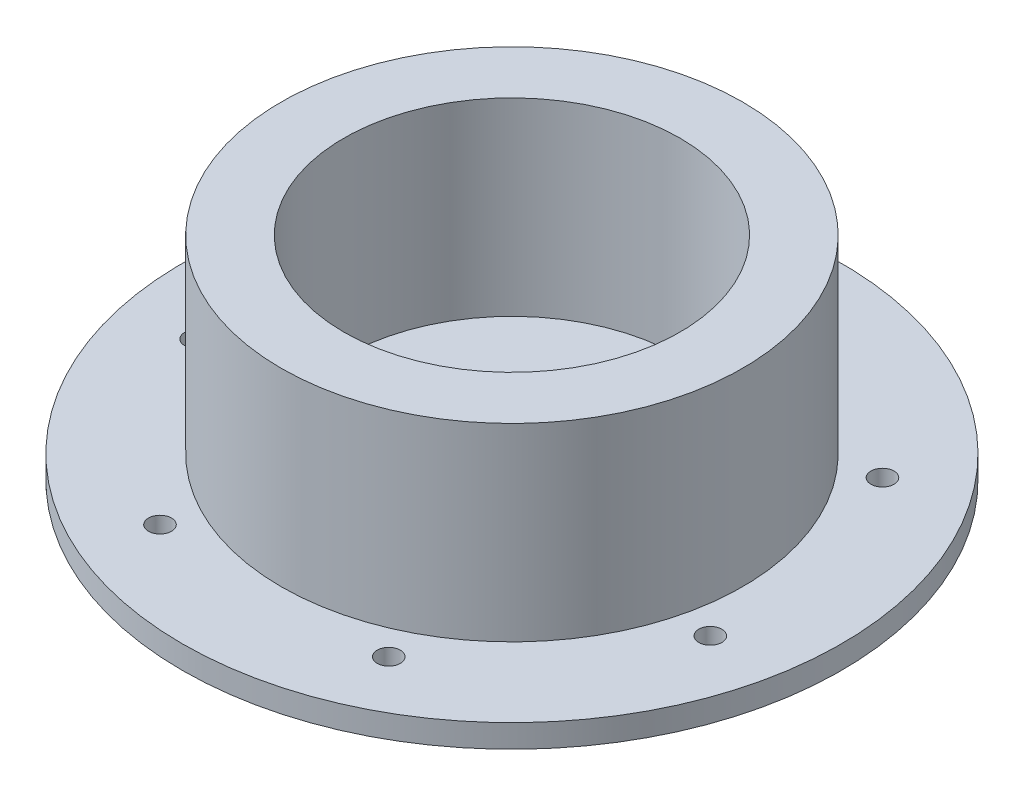
ISO-10303-21;
HEADER;
FILE_DESCRIPTION(('STEP AP214'),'2;1');
FILE_NAME('part.step','',(''),(''),'','','');
FILE_SCHEMA(('AUTOMOTIVE_DESIGN { 1 0 10303 214 1 1 1 1 }'));
ENDSEC;
DATA;
#1=APPLICATION_CONTEXT('core data for automotive mechanical design processes');
#2=APPLICATION_PROTOCOL_DEFINITION('international standard','automotive_design',2000,#1);
#3=PRODUCT_CONTEXT('',#1,'mechanical');
#4=PRODUCT('Part','Part','',(#3));
#5=PRODUCT_RELATED_PRODUCT_CATEGORY('part','',(#4));
#6=PRODUCT_DEFINITION_FORMATION('','',#4);
#7=PRODUCT_DEFINITION_CONTEXT('part definition',#1,'design');
#8=PRODUCT_DEFINITION('design','',#6,#7);
#9=PRODUCT_DEFINITION_SHAPE('','',#8);
#10=(LENGTH_UNIT() NAMED_UNIT(*) SI_UNIT(.MILLI.,.METRE.));
#11=(NAMED_UNIT(*) PLANE_ANGLE_UNIT() SI_UNIT($,.RADIAN.));
#12=(NAMED_UNIT(*) SI_UNIT($,.STERADIAN.) SOLID_ANGLE_UNIT());
#13=UNCERTAINTY_MEASURE_WITH_UNIT(LENGTH_MEASURE(1.E-05),#10,'distance_accuracy_value','');
#14=(GEOMETRIC_REPRESENTATION_CONTEXT(3) GLOBAL_UNCERTAINTY_ASSIGNED_CONTEXT((#13)) GLOBAL_UNIT_ASSIGNED_CONTEXT((#10,
#11,#12)) REPRESENTATION_CONTEXT('',''));
#15=CARTESIAN_POINT('',(0.,0.,0.));
#16=DIRECTION('',(0.,0.,1.));
#17=DIRECTION('',(1.,0.,0.));
#18=AXIS2_PLACEMENT_3D('',#15,#16,#17);
#19=CARTESIAN_POINT('',(0.,3.5,0.));
#20=DIRECTION('',(0.,1.,0.));
#21=DIRECTION('',(0.,0.,1.));
#22=AXIS2_PLACEMENT_3D('',#19,#20,#21);
#23=PLANE('',#22);
#24=CARTESIAN_POINT('',(0.,3.5,0.));
#25=DIRECTION('',(0.,1.,0.));
#26=DIRECTION('',(0.,0.,1.));
#27=AXIS2_PLACEMENT_3D('',#24,#25,#26);
#28=CIRCLE('',#27,35.);
#29=CARTESIAN_POINT('',(0.,3.5,35.));
#30=VERTEX_POINT('',#29);
#31=EDGE_CURVE('E95',#30,#30,#28,.T.);
#32=ORIENTED_EDGE('',*,*,#31,.F.);
#33=EDGE_LOOP('',(#32));
#34=FACE_BOUND('',#33,.T.);
#35=CARTESIAN_POINT('',(-38.997116487268,3.5,8.90083735825651));
#36=DIRECTION('',(0.,1.,0.));
#37=DIRECTION('',(0.,0.,1.));
#38=AXIS2_PLACEMENT_3D('',#35,#36,#37);
#39=CIRCLE('',#38,1.75);
#40=CARTESIAN_POINT('',(-38.997116487268,3.5,10.6508373582565));
#41=VERTEX_POINT('',#40);
#42=EDGE_CURVE('E80',#41,#41,#39,.T.);
#43=ORIENTED_EDGE('',*,*,#42,.F.);
#44=EDGE_LOOP('',(#43));
#45=FACE_BOUND('',#44,.T.);
#46=CARTESIAN_POINT('',(17.35534956471,3.5,36.038754716095));
#47=DIRECTION('',(0.,1.,0.));
#48=DIRECTION('',(0.,0.,1.));
#49=AXIS2_PLACEMENT_3D('',#46,#47,#48);
#50=CIRCLE('',#49,1.75);
#51=CARTESIAN_POINT('',(17.35534956471,3.5,37.788754716095));
#52=VERTEX_POINT('',#51);
#53=EDGE_CURVE('E68',#52,#52,#50,.T.);
#54=ORIENTED_EDGE('',*,*,#53,.F.);
#55=EDGE_LOOP('',(#54));
#56=FACE_BOUND('',#55,.T.);
#57=CARTESIAN_POINT('',(31.2732592987227,3.5,-24.9395920743525));
#58=DIRECTION('',(0.,1.,0.));
#59=DIRECTION('',(0.,0.,1.));
#60=AXIS2_PLACEMENT_3D('',#57,#58,#59);
#61=CIRCLE('',#60,1.75);
#62=CARTESIAN_POINT('',(31.2732592987227,3.5,-23.1895920743525));
#63=VERTEX_POINT('',#62);
#64=EDGE_CURVE('E56',#63,#63,#61,.T.);
#65=ORIENTED_EDGE('',*,*,#64,.F.);
#66=EDGE_LOOP('',(#65));
#67=FACE_BOUND('',#66,.T.);
#68=CARTESIAN_POINT('',(0.,3.5,0.));
#69=DIRECTION('',(0.,1.,0.));
#70=DIRECTION('',(0.,0.,1.));
#71=AXIS2_PLACEMENT_3D('',#68,#69,#70);
#72=CIRCLE('',#71,50.);
#73=CARTESIAN_POINT('',(0.,3.5,50.));
#74=VERTEX_POINT('',#73);
#75=EDGE_CURVE('E42',#74,#74,#72,.T.);
#76=ORIENTED_EDGE('',*,*,#75,.T.);
#77=EDGE_LOOP('',(#76));
#78=FACE_BOUND('',#77,.T.);
#79=CARTESIAN_POINT('',(0.,3.5,-40.));
#80=DIRECTION('',(0.,1.,0.));
#81=DIRECTION('',(0.,0.,1.));
#82=AXIS2_PLACEMENT_3D('',#79,#80,#81);
#83=CIRCLE('',#82,1.75);
#84=CARTESIAN_POINT('',(0.,3.5,-38.25));
#85=VERTEX_POINT('',#84);
#86=EDGE_CURVE('E51',#85,#85,#83,.T.);
#87=ORIENTED_EDGE('',*,*,#86,.F.);
#88=EDGE_LOOP('',(#87));
#89=FACE_BOUND('',#88,.T.);
#90=CARTESIAN_POINT('',(38.9971164872779,3.5,8.90083735824865));
#91=DIRECTION('',(0.,1.,0.));
#92=DIRECTION('',(0.,0.,1.));
#93=AXIS2_PLACEMENT_3D('',#90,#91,#92);
#94=CIRCLE('',#93,1.75);
#95=CARTESIAN_POINT('',(38.9971164872779,3.5,10.6508373582487));
#96=VERTEX_POINT('',#95);
#97=EDGE_CURVE('E62',#96,#96,#94,.T.);
#98=ORIENTED_EDGE('',*,*,#97,.F.);
#99=EDGE_LOOP('',(#98));
#100=FACE_BOUND('',#99,.T.);
#101=CARTESIAN_POINT('',(-17.3553495646947,3.5,36.0387547160985));
#102=DIRECTION('',(0.,1.,0.));
#103=DIRECTION('',(0.,0.,1.));
#104=AXIS2_PLACEMENT_3D('',#101,#102,#103);
#105=CIRCLE('',#104,1.75);
#106=CARTESIAN_POINT('',(-17.3553495646947,3.5,37.7887547160985));
#107=VERTEX_POINT('',#106);
#108=EDGE_CURVE('E74',#107,#107,#105,.T.);
#109=ORIENTED_EDGE('',*,*,#108,.F.);
#110=EDGE_LOOP('',(#109));
#111=FACE_BOUND('',#110,.T.);
#112=CARTESIAN_POINT('',(-31.2732592987197,3.5,-24.9395920743462));
#113=DIRECTION('',(0.,1.,0.));
#114=DIRECTION('',(0.,0.,1.));
#115=AXIS2_PLACEMENT_3D('',#112,#113,#114);
#116=CIRCLE('',#115,1.75);
#117=CARTESIAN_POINT('',(-31.2732592987197,3.5,-23.1895920743462));
#118=VERTEX_POINT('',#117);
#119=EDGE_CURVE('E86',#118,#118,#116,.T.);
#120=ORIENTED_EDGE('',*,*,#119,.F.);
#121=EDGE_LOOP('',(#120));
#122=FACE_BOUND('',#121,.T.);
#123=ADVANCED_FACE('F35',(#34,#45,#56,#67,#78,#89,#100,#111,#122),#23,.T.);
#124=CARTESIAN_POINT('',(0.,0.,0.));
#125=DIRECTION('',(0.,1.,0.));
#126=DIRECTION('',(0.,0.,1.));
#127=AXIS2_PLACEMENT_3D('',#124,#125,#126);
#128=PLANE('',#127);
#129=CARTESIAN_POINT('',(0.,0.,0.));
#130=DIRECTION('',(0.,1.,0.));
#131=DIRECTION('',(0.,0.,1.));
#132=AXIS2_PLACEMENT_3D('',#129,#130,#131);
#133=CIRCLE('',#132,50.);
#134=CARTESIAN_POINT('',(0.,0.,50.));
#135=VERTEX_POINT('',#134);
#136=EDGE_CURVE('E46',#135,#135,#133,.T.);
#137=ORIENTED_EDGE('',*,*,#136,.F.);
#138=EDGE_LOOP('',(#137));
#139=FACE_BOUND('',#138,.T.);
#140=CARTESIAN_POINT('',(0.,0.,-40.));
#141=DIRECTION('',(0.,1.,0.));
#142=DIRECTION('',(0.,0.,1.));
#143=AXIS2_PLACEMENT_3D('',#140,#141,#142);
#144=CIRCLE('',#143,1.75);
#145=CARTESIAN_POINT('',(0.,0.,-38.25));
#146=VERTEX_POINT('',#145);
#147=EDGE_CURVE('E53',#146,#146,#144,.T.);
#148=ORIENTED_EDGE('',*,*,#147,.T.);
#149=EDGE_LOOP('',(#148));
#150=FACE_BOUND('',#149,.T.);
#151=CARTESIAN_POINT('',(31.2732592987227,0.,-24.9395920743525));
#152=DIRECTION('',(0.,1.,0.));
#153=DIRECTION('',(0.,0.,1.));
#154=AXIS2_PLACEMENT_3D('',#151,#152,#153);
#155=CIRCLE('',#154,1.75);
#156=CARTESIAN_POINT('',(31.2732592987227,0.,-23.1895920743525));
#157=VERTEX_POINT('',#156);
#158=EDGE_CURVE('E59',#157,#157,#155,.T.);
#159=ORIENTED_EDGE('',*,*,#158,.T.);
#160=EDGE_LOOP('',(#159));
#161=FACE_BOUND('',#160,.T.);
#162=CARTESIAN_POINT('',(38.9971164872779,0.,8.90083735824865));
#163=DIRECTION('',(0.,1.,0.));
#164=DIRECTION('',(0.,0.,1.));
#165=AXIS2_PLACEMENT_3D('',#162,#163,#164);
#166=CIRCLE('',#165,1.75);
#167=CARTESIAN_POINT('',(38.9971164872779,0.,10.6508373582487));
#168=VERTEX_POINT('',#167);
#169=EDGE_CURVE('E65',#168,#168,#166,.T.);
#170=ORIENTED_EDGE('',*,*,#169,.T.);
#171=EDGE_LOOP('',(#170));
#172=FACE_BOUND('',#171,.T.);
#173=CARTESIAN_POINT('',(17.35534956471,0.,36.038754716095));
#174=DIRECTION('',(0.,1.,0.));
#175=DIRECTION('',(0.,0.,1.));
#176=AXIS2_PLACEMENT_3D('',#173,#174,#175);
#177=CIRCLE('',#176,1.75);
#178=CARTESIAN_POINT('',(17.35534956471,0.,37.788754716095));
#179=VERTEX_POINT('',#178);
#180=EDGE_CURVE('E71',#179,#179,#177,.T.);
#181=ORIENTED_EDGE('',*,*,#180,.T.);
#182=EDGE_LOOP('',(#181));
#183=FACE_BOUND('',#182,.T.);
#184=CARTESIAN_POINT('',(-17.3553495646947,0.,36.0387547160985));
#185=DIRECTION('',(0.,1.,0.));
#186=DIRECTION('',(0.,0.,1.));
#187=AXIS2_PLACEMENT_3D('',#184,#185,#186);
#188=CIRCLE('',#187,1.75);
#189=CARTESIAN_POINT('',(-17.3553495646947,0.,37.7887547160985));
#190=VERTEX_POINT('',#189);
#191=EDGE_CURVE('E77',#190,#190,#188,.T.);
#192=ORIENTED_EDGE('',*,*,#191,.T.);
#193=EDGE_LOOP('',(#192));
#194=FACE_BOUND('',#193,.T.);
#195=CARTESIAN_POINT('',(-38.997116487268,0.,8.90083735825651));
#196=DIRECTION('',(0.,1.,0.));
#197=DIRECTION('',(0.,0.,1.));
#198=AXIS2_PLACEMENT_3D('',#195,#196,#197);
#199=CIRCLE('',#198,1.75);
#200=CARTESIAN_POINT('',(-38.997116487268,0.,10.6508373582565));
#201=VERTEX_POINT('',#200);
#202=EDGE_CURVE('E83',#201,#201,#199,.T.);
#203=ORIENTED_EDGE('',*,*,#202,.T.);
#204=EDGE_LOOP('',(#203));
#205=FACE_BOUND('',#204,.T.);
#206=CARTESIAN_POINT('',(-31.2732592987197,0.,-24.9395920743462));
#207=DIRECTION('',(0.,1.,0.));
#208=DIRECTION('',(0.,0.,1.));
#209=AXIS2_PLACEMENT_3D('',#206,#207,#208);
#210=CIRCLE('',#209,1.75);
#211=CARTESIAN_POINT('',(-31.2732592987197,0.,-23.1895920743462));
#212=VERTEX_POINT('',#211);
#213=EDGE_CURVE('E89',#212,#212,#210,.T.);
#214=ORIENTED_EDGE('',*,*,#213,.T.);
#215=EDGE_LOOP('',(#214));
#216=FACE_BOUND('',#215,.T.);
#217=ADVANCED_FACE('F123',(#139,#150,#161,#172,#183,#194,#205,#216),#128,.F.);
#218=CARTESIAN_POINT('',(0.,3.5,0.));
#219=DIRECTION('',(0.,-1.,0.));
#220=DIRECTION('',(0.,0.,-1.));
#221=AXIS2_PLACEMENT_3D('',#218,#219,#220);
#222=CYLINDRICAL_SURFACE('',#221,50.);
#223=ORIENTED_EDGE('',*,*,#75,.F.);
#224=EDGE_LOOP('',(#223));
#225=FACE_BOUND('',#224,.T.);
#226=ORIENTED_EDGE('',*,*,#136,.T.);
#227=EDGE_LOOP('',(#226));
#228=FACE_BOUND('',#227,.T.);
#229=ADVANCED_FACE('F37',(#225,#228),#222,.T.);
#230=CARTESIAN_POINT('',(0.,3.5,-40.));
#231=DIRECTION('',(0.,-1.,0.));
#232=DIRECTION('',(0.,0.,-1.));
#233=AXIS2_PLACEMENT_3D('',#230,#231,#232);
#234=CYLINDRICAL_SURFACE('',#233,1.75);
#235=ORIENTED_EDGE('',*,*,#86,.T.);
#236=EDGE_LOOP('',(#235));
#237=FACE_BOUND('',#236,.T.);
#238=ORIENTED_EDGE('',*,*,#147,.F.);
#239=EDGE_LOOP('',(#238));
#240=FACE_BOUND('',#239,.T.);
#241=ADVANCED_FACE('F210',(#237,#240),#234,.F.);
#242=CARTESIAN_POINT('',(31.2732592987227,3.5,-24.9395920743525));
#243=DIRECTION('',(0.,-1.,0.));
#244=DIRECTION('',(0.,0.,-1.));
#245=AXIS2_PLACEMENT_3D('',#242,#243,#244);
#246=CYLINDRICAL_SURFACE('',#245,1.75);
#247=ORIENTED_EDGE('',*,*,#64,.T.);
#248=EDGE_LOOP('',(#247));
#249=FACE_BOUND('',#248,.T.);
#250=ORIENTED_EDGE('',*,*,#158,.F.);
#251=EDGE_LOOP('',(#250));
#252=FACE_BOUND('',#251,.T.);
#253=ADVANCED_FACE('F200',(#249,#252),#246,.F.);
#254=CARTESIAN_POINT('',(38.9971164872779,3.5,8.90083735824865));
#255=DIRECTION('',(0.,-1.,0.));
#256=DIRECTION('',(0.,0.,-1.));
#257=AXIS2_PLACEMENT_3D('',#254,#255,#256);
#258=CYLINDRICAL_SURFACE('',#257,1.75);
#259=ORIENTED_EDGE('',*,*,#97,.T.);
#260=EDGE_LOOP('',(#259));
#261=FACE_BOUND('',#260,.T.);
#262=ORIENTED_EDGE('',*,*,#169,.F.);
#263=EDGE_LOOP('',(#262));
#264=FACE_BOUND('',#263,.T.);
#265=ADVANCED_FACE('F190',(#261,#264),#258,.F.);
#266=CARTESIAN_POINT('',(17.35534956471,3.5,36.038754716095));
#267=DIRECTION('',(0.,-1.,0.));
#268=DIRECTION('',(0.,0.,-1.));
#269=AXIS2_PLACEMENT_3D('',#266,#267,#268);
#270=CYLINDRICAL_SURFACE('',#269,1.75);
#271=ORIENTED_EDGE('',*,*,#53,.T.);
#272=EDGE_LOOP('',(#271));
#273=FACE_BOUND('',#272,.T.);
#274=ORIENTED_EDGE('',*,*,#180,.F.);
#275=EDGE_LOOP('',(#274));
#276=FACE_BOUND('',#275,.T.);
#277=ADVANCED_FACE('F180',(#273,#276),#270,.F.);
#278=CARTESIAN_POINT('',(-17.3553495646947,3.5,36.0387547160985));
#279=DIRECTION('',(0.,-1.,0.));
#280=DIRECTION('',(0.,0.,-1.));
#281=AXIS2_PLACEMENT_3D('',#278,#279,#280);
#282=CYLINDRICAL_SURFACE('',#281,1.75);
#283=ORIENTED_EDGE('',*,*,#108,.T.);
#284=EDGE_LOOP('',(#283));
#285=FACE_BOUND('',#284,.T.);
#286=ORIENTED_EDGE('',*,*,#191,.F.);
#287=EDGE_LOOP('',(#286));
#288=FACE_BOUND('',#287,.T.);
#289=ADVANCED_FACE('F170',(#285,#288),#282,.F.);
#290=CARTESIAN_POINT('',(-38.997116487268,3.5,8.90083735825651));
#291=DIRECTION('',(0.,-1.,0.));
#292=DIRECTION('',(0.,0.,-1.));
#293=AXIS2_PLACEMENT_3D('',#290,#291,#292);
#294=CYLINDRICAL_SURFACE('',#293,1.75);
#295=ORIENTED_EDGE('',*,*,#42,.T.);
#296=EDGE_LOOP('',(#295));
#297=FACE_BOUND('',#296,.T.);
#298=ORIENTED_EDGE('',*,*,#202,.F.);
#299=EDGE_LOOP('',(#298));
#300=FACE_BOUND('',#299,.T.);
#301=ADVANCED_FACE('F118',(#297,#300),#294,.F.);
#302=CARTESIAN_POINT('',(-31.2732592987197,3.5,-24.9395920743462));
#303=DIRECTION('',(0.,-1.,0.));
#304=DIRECTION('',(0.,0.,-1.));
#305=AXIS2_PLACEMENT_3D('',#302,#303,#304);
#306=CYLINDRICAL_SURFACE('',#305,1.75);
#307=ORIENTED_EDGE('',*,*,#119,.T.);
#308=EDGE_LOOP('',(#307));
#309=FACE_BOUND('',#308,.T.);
#310=ORIENTED_EDGE('',*,*,#213,.F.);
#311=EDGE_LOOP('',(#310));
#312=FACE_BOUND('',#311,.T.);
#313=ADVANCED_FACE('F109',(#309,#312),#306,.F.);
#314=CARTESIAN_POINT('',(0.,32.2,0.));
#315=DIRECTION('',(0.,1.,0.));
#316=DIRECTION('',(0.,0.,1.));
#317=AXIS2_PLACEMENT_3D('',#314,#315,#316);
#318=PLANE('',#317);
#319=CARTESIAN_POINT('',(0.,32.2,0.));
#320=DIRECTION('',(0.,1.,0.));
#321=DIRECTION('',(0.,0.,1.));
#322=AXIS2_PLACEMENT_3D('',#319,#320,#321);
#323=CIRCLE('',#322,35.);
#324=CARTESIAN_POINT('',(0.,32.2,35.));
#325=VERTEX_POINT('',#324);
#326=EDGE_CURVE('E92',#325,#325,#323,.T.);
#327=ORIENTED_EDGE('',*,*,#326,.T.);
#328=EDGE_LOOP('',(#327));
#329=FACE_BOUND('',#328,.T.);
#330=CARTESIAN_POINT('',(0.,32.2,0.));
#331=DIRECTION('',(0.,1.,0.));
#332=DIRECTION('',(0.,0.,1.));
#333=AXIS2_PLACEMENT_3D('',#330,#331,#332);
#334=CIRCLE('',#333,25.5);
#335=CARTESIAN_POINT('',(0.,32.2,25.5));
#336=VERTEX_POINT('',#335);
#337=EDGE_CURVE('E98',#336,#336,#334,.T.);
#338=ORIENTED_EDGE('',*,*,#337,.F.);
#339=EDGE_LOOP('',(#338));
#340=FACE_BOUND('',#339,.T.);
#341=ADVANCED_FACE('F106',(#329,#340),#318,.T.);
#342=CARTESIAN_POINT('',(0.,32.2,0.));
#343=DIRECTION('',(0.,-1.,0.));
#344=DIRECTION('',(0.,0.,-1.));
#345=AXIS2_PLACEMENT_3D('',#342,#343,#344);
#346=CYLINDRICAL_SURFACE('',#345,35.);
#347=ORIENTED_EDGE('',*,*,#326,.F.);
#348=EDGE_LOOP('',(#347));
#349=FACE_BOUND('',#348,.T.);
#350=ORIENTED_EDGE('',*,*,#31,.T.);
#351=EDGE_LOOP('',(#350));
#352=FACE_BOUND('',#351,.T.);
#353=ADVANCED_FACE('F108',(#349,#352),#346,.T.);
#354=CARTESIAN_POINT('',(0.,32.2,0.));
#355=DIRECTION('',(0.,-1.,0.));
#356=DIRECTION('',(0.,0.,-1.));
#357=AXIS2_PLACEMENT_3D('',#354,#355,#356);
#358=CYLINDRICAL_SURFACE('',#357,25.5);
#359=ORIENTED_EDGE('',*,*,#337,.T.);
#360=EDGE_LOOP('',(#359));
#361=FACE_BOUND('',#360,.T.);
#362=CARTESIAN_POINT('',(0.,3.5,0.));
#363=DIRECTION('',(0.,1.,0.));
#364=DIRECTION('',(0.,0.,1.));
#365=AXIS2_PLACEMENT_3D('',#362,#363,#364);
#366=CIRCLE('',#365,25.5);
#367=CARTESIAN_POINT('',(0.,3.5,25.5));
#368=VERTEX_POINT('',#367);
#369=EDGE_CURVE('E10',#368,#368,#366,.F.);
#370=ORIENTED_EDGE('',*,*,#369,.T.);
#371=EDGE_LOOP('',(#370));
#372=FACE_BOUND('',#371,.T.);
#373=ADVANCED_FACE('F104',(#361,#372),#358,.F.);
#374=ORIENTED_EDGE('',*,*,#369,.F.);
#375=EDGE_LOOP('',(#374));
#376=FACE_BOUND('',#375,.T.);
#377=ADVANCED_FACE('F126',(#376),#23,.T.);
#378=CLOSED_SHELL('',(#123,#217,#229,#241,#253,#265,#277,#289,#301,#313,#341,#353,#373,#377));
#379=MANIFOLD_SOLID_BREP('B2',#378);
#380=ADVANCED_BREP_SHAPE_REPRESENTATION('',(#18,#379),#14);
#381=SHAPE_DEFINITION_REPRESENTATION(#9,#380);
ENDSEC;
END-ISO-10303-21;
